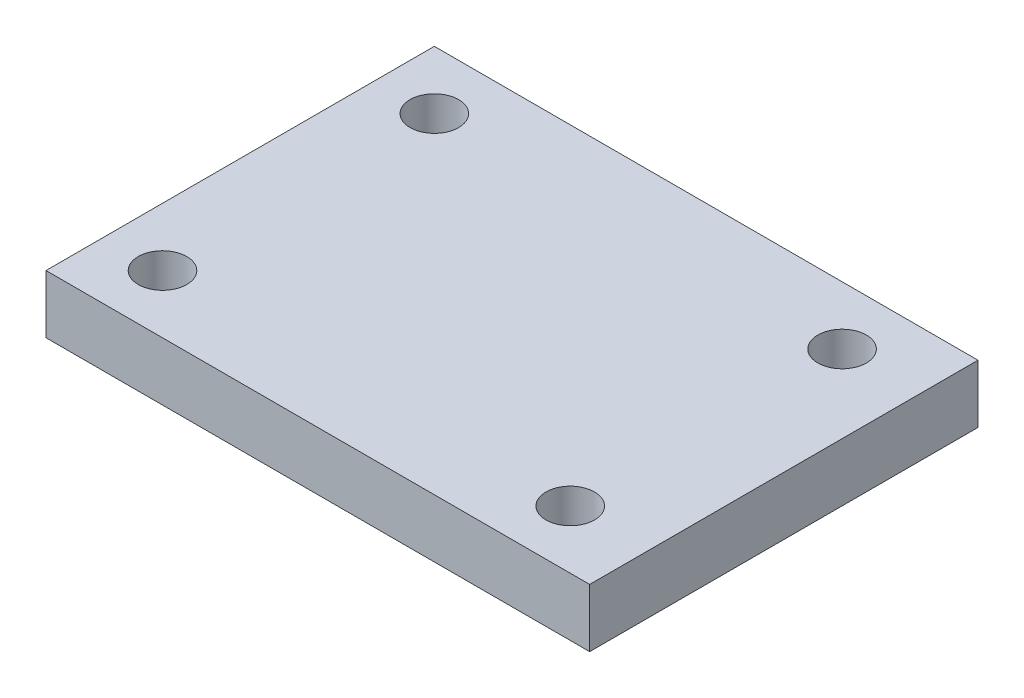
ISO-10303-21;
HEADER;
FILE_DESCRIPTION(('STEP AP214'),'2;1');
FILE_NAME('part.step','',(''),(''),'','','');
FILE_SCHEMA(('AUTOMOTIVE_DESIGN { 1 0 10303 214 1 1 1 1 }'));
ENDSEC;
DATA;
#1=APPLICATION_CONTEXT('core data for automotive mechanical design processes');
#2=APPLICATION_PROTOCOL_DEFINITION('international standard','automotive_design',2000,#1);
#3=PRODUCT_CONTEXT('',#1,'mechanical');
#4=PRODUCT('Part','Part','',(#3));
#5=PRODUCT_RELATED_PRODUCT_CATEGORY('part','',(#4));
#6=PRODUCT_DEFINITION_FORMATION('','',#4);
#7=PRODUCT_DEFINITION_CONTEXT('part definition',#1,'design');
#8=PRODUCT_DEFINITION('design','',#6,#7);
#9=PRODUCT_DEFINITION_SHAPE('','',#8);
#10=(LENGTH_UNIT() NAMED_UNIT(*) SI_UNIT(.MILLI.,.METRE.));
#11=(NAMED_UNIT(*) PLANE_ANGLE_UNIT() SI_UNIT($,.RADIAN.));
#12=(NAMED_UNIT(*) SI_UNIT($,.STERADIAN.) SOLID_ANGLE_UNIT());
#13=UNCERTAINTY_MEASURE_WITH_UNIT(LENGTH_MEASURE(1.E-05),#10,'distance_accuracy_value','');
#14=(GEOMETRIC_REPRESENTATION_CONTEXT(3) GLOBAL_UNCERTAINTY_ASSIGNED_CONTEXT((#13)) GLOBAL_UNIT_ASSIGNED_CONTEXT((#10,
#11,#12)) REPRESENTATION_CONTEXT('',''));
#15=CARTESIAN_POINT('',(0.,0.,0.));
#16=DIRECTION('',(0.,0.,1.));
#17=DIRECTION('',(1.,0.,0.));
#18=AXIS2_PLACEMENT_3D('',#15,#16,#17);
#19=CARTESIAN_POINT('',(14.,3.,10.));
#20=DIRECTION('',(-1.,0.,0.));
#21=DIRECTION('',(0.,0.,1.));
#22=AXIS2_PLACEMENT_3D('',#19,#20,#21);
#23=PLANE('',#22);
#24=DIRECTION('',(0.,0.,-1.));
#25=VECTOR('',#24,1.);
#26=CARTESIAN_POINT('',(14.,0.,10.));
#27=LINE('',#26,#25);
#28=CARTESIAN_POINT('',(14.,0.,10.));
#29=VERTEX_POINT('',#28);
#30=CARTESIAN_POINT('',(14.,0.,-10.));
#31=VERTEX_POINT('',#30);
#32=EDGE_CURVE('E101',#29,#31,#27,.T.);
#33=ORIENTED_EDGE('',*,*,#32,.T.);
#34=DIRECTION('',(0.,-1.,0.));
#35=VECTOR('',#34,1.);
#36=CARTESIAN_POINT('',(14.,3.,-10.));
#37=LINE('',#36,#35);
#38=CARTESIAN_POINT('',(14.,3.,-10.));
#39=VERTEX_POINT('',#38);
#40=EDGE_CURVE('E11',#39,#31,#37,.T.);
#41=ORIENTED_EDGE('',*,*,#40,.F.);
#42=DIRECTION('',(0.,0.,-1.));
#43=VECTOR('',#42,1.);
#44=CARTESIAN_POINT('',(14.,3.,10.));
#45=LINE('',#44,#43);
#46=CARTESIAN_POINT('',(14.,3.,10.));
#47=VERTEX_POINT('',#46);
#48=EDGE_CURVE('E89',#47,#39,#45,.T.);
#49=ORIENTED_EDGE('',*,*,#48,.F.);
#50=DIRECTION('',(0.,-1.,0.));
#51=VECTOR('',#50,1.);
#52=CARTESIAN_POINT('',(14.,3.,10.));
#53=LINE('',#52,#51);
#54=EDGE_CURVE('E97',#47,#29,#53,.T.);
#55=ORIENTED_EDGE('',*,*,#54,.T.);
#56=EDGE_LOOP('',(#33,#41,#49,#55));
#57=FACE_BOUND('',#56,.T.);
#58=ADVANCED_FACE('F38',(#57),#23,.F.);
#59=CARTESIAN_POINT('',(-14.,3.,-10.));
#60=DIRECTION('',(0.,0.,1.));
#61=DIRECTION('',(1.,0.,0.));
#62=AXIS2_PLACEMENT_3D('',#59,#60,#61);
#63=PLANE('',#62);
#64=DIRECTION('',(-1.,0.,0.));
#65=VECTOR('',#64,1.);
#66=CARTESIAN_POINT('',(-14.,0.,-10.));
#67=LINE('',#66,#65);
#68=CARTESIAN_POINT('',(-14.,0.,-10.));
#69=VERTEX_POINT('',#68);
#70=EDGE_CURVE('E93',#31,#69,#67,.T.);
#71=ORIENTED_EDGE('',*,*,#70,.T.);
#72=DIRECTION('',(0.,-1.,0.));
#73=VECTOR('',#72,1.);
#74=CARTESIAN_POINT('',(-14.,3.,-10.));
#75=LINE('',#74,#73);
#76=CARTESIAN_POINT('',(-14.,3.,-10.));
#77=VERTEX_POINT('',#76);
#78=EDGE_CURVE('E46',#77,#69,#75,.T.);
#79=ORIENTED_EDGE('',*,*,#78,.F.);
#80=DIRECTION('',(-1.,0.,0.));
#81=VECTOR('',#80,1.);
#82=CARTESIAN_POINT('',(-14.,3.,-10.));
#83=LINE('',#82,#81);
#84=EDGE_CURVE('E84',#39,#77,#83,.T.);
#85=ORIENTED_EDGE('',*,*,#84,.F.);
#86=ORIENTED_EDGE('',*,*,#40,.T.);
#87=EDGE_LOOP('',(#71,#79,#85,#86));
#88=FACE_BOUND('',#87,.T.);
#89=ADVANCED_FACE('F92',(#88),#63,.F.);
#90=CARTESIAN_POINT('',(-14.,3.,10.));
#91=DIRECTION('',(1.,0.,0.));
#92=DIRECTION('',(0.,0.,-1.));
#93=AXIS2_PLACEMENT_3D('',#90,#91,#92);
#94=PLANE('',#93);
#95=DIRECTION('',(0.,0.,1.));
#96=VECTOR('',#95,1.);
#97=CARTESIAN_POINT('',(-14.,0.,10.));
#98=LINE('',#97,#96);
#99=CARTESIAN_POINT('',(-14.,0.,10.));
#100=VERTEX_POINT('',#99);
#101=EDGE_CURVE('E71',#69,#100,#98,.T.);
#102=ORIENTED_EDGE('',*,*,#101,.T.);
#103=DIRECTION('',(0.,-1.,0.));
#104=VECTOR('',#103,1.);
#105=CARTESIAN_POINT('',(-14.,3.,10.));
#106=LINE('',#105,#104);
#107=CARTESIAN_POINT('',(-14.,3.,10.));
#108=VERTEX_POINT('',#107);
#109=EDGE_CURVE('E94',#108,#100,#106,.T.);
#110=ORIENTED_EDGE('',*,*,#109,.F.);
#111=DIRECTION('',(0.,0.,1.));
#112=VECTOR('',#111,1.);
#113=CARTESIAN_POINT('',(-14.,3.,10.));
#114=LINE('',#113,#112);
#115=EDGE_CURVE('E87',#77,#108,#114,.T.);
#116=ORIENTED_EDGE('',*,*,#115,.F.);
#117=ORIENTED_EDGE('',*,*,#78,.T.);
#118=EDGE_LOOP('',(#102,#110,#116,#117));
#119=FACE_BOUND('',#118,.T.);
#120=ADVANCED_FACE('F95',(#119),#94,.F.);
#121=CARTESIAN_POINT('',(-14.,3.,10.));
#122=DIRECTION('',(0.,0.,-1.));
#123=DIRECTION('',(-1.,0.,0.));
#124=AXIS2_PLACEMENT_3D('',#121,#122,#123);
#125=PLANE('',#124);
#126=DIRECTION('',(1.,0.,0.));
#127=VECTOR('',#126,1.);
#128=CARTESIAN_POINT('',(-14.,0.,10.));
#129=LINE('',#128,#127);
#130=EDGE_CURVE('E77',#100,#29,#129,.T.);
#131=ORIENTED_EDGE('',*,*,#130,.T.);
#132=ORIENTED_EDGE('',*,*,#54,.F.);
#133=DIRECTION('',(1.,0.,0.));
#134=VECTOR('',#133,1.);
#135=CARTESIAN_POINT('',(-14.,3.,10.));
#136=LINE('',#135,#134);
#137=EDGE_CURVE('E54',#108,#47,#136,.T.);
#138=ORIENTED_EDGE('',*,*,#137,.F.);
#139=ORIENTED_EDGE('',*,*,#109,.T.);
#140=EDGE_LOOP('',(#131,#132,#138,#139));
#141=FACE_BOUND('',#140,.T.);
#142=ADVANCED_FACE('F109',(#141),#125,.F.);
#143=CARTESIAN_POINT('',(0.,3.,0.));
#144=DIRECTION('',(0.,-1.,0.));
#145=DIRECTION('',(0.,0.,-1.));
#146=AXIS2_PLACEMENT_3D('',#143,#144,#145);
#147=PLANE('',#146);
#148=CARTESIAN_POINT('',(-11.,3.,-7.));
#149=DIRECTION('',(0.,1.,0.));
#150=DIRECTION('',(0.,0.,1.));
#151=AXIS2_PLACEMENT_3D('',#148,#149,#150);
#152=CIRCLE('',#151,1.25);
#153=CARTESIAN_POINT('',(-11.,3.,-5.75));
#154=VERTEX_POINT('',#153);
#155=EDGE_CURVE('E135',#154,#154,#152,.T.);
#156=ORIENTED_EDGE('',*,*,#155,.F.);
#157=EDGE_LOOP('',(#156));
#158=FACE_BOUND('',#157,.T.);
#159=CARTESIAN_POINT('',(10.,3.,-7.));
#160=DIRECTION('',(0.,1.,0.));
#161=DIRECTION('',(0.,0.,1.));
#162=AXIS2_PLACEMENT_3D('',#159,#160,#161);
#163=CIRCLE('',#162,1.25);
#164=CARTESIAN_POINT('',(10.,3.,-5.75));
#165=VERTEX_POINT('',#164);
#166=EDGE_CURVE('E129',#165,#165,#163,.T.);
#167=ORIENTED_EDGE('',*,*,#166,.F.);
#168=EDGE_LOOP('',(#167));
#169=FACE_BOUND('',#168,.T.);
#170=CARTESIAN_POINT('',(10.,3.,7.));
#171=DIRECTION('',(0.,1.,0.));
#172=DIRECTION('',(0.,0.,1.));
#173=AXIS2_PLACEMENT_3D('',#170,#171,#172);
#174=CIRCLE('',#173,1.25);
#175=CARTESIAN_POINT('',(10.,3.,8.25));
#176=VERTEX_POINT('',#175);
#177=EDGE_CURVE('E123',#176,#176,#174,.T.);
#178=ORIENTED_EDGE('',*,*,#177,.F.);
#179=EDGE_LOOP('',(#178));
#180=FACE_BOUND('',#179,.T.);
#181=CARTESIAN_POINT('',(-11.,3.,7.));
#182=DIRECTION('',(0.,1.,0.));
#183=DIRECTION('',(0.,0.,1.));
#184=AXIS2_PLACEMENT_3D('',#181,#182,#183);
#185=CIRCLE('',#184,1.25);
#186=CARTESIAN_POINT('',(-11.,3.,8.25));
#187=VERTEX_POINT('',#186);
#188=EDGE_CURVE('E117',#187,#187,#185,.T.);
#189=ORIENTED_EDGE('',*,*,#188,.F.);
#190=EDGE_LOOP('',(#189));
#191=FACE_BOUND('',#190,.T.);
#192=ORIENTED_EDGE('',*,*,#48,.T.);
#193=ORIENTED_EDGE('',*,*,#84,.T.);
#194=ORIENTED_EDGE('',*,*,#115,.T.);
#195=ORIENTED_EDGE('',*,*,#137,.T.);
#196=EDGE_LOOP('',(#192,#193,#194,#195));
#197=FACE_BOUND('',#196,.T.);
#198=ADVANCED_FACE('F85',(#158,#169,#180,#191,#197),#147,.F.);
#199=CARTESIAN_POINT('',(0.,0.,0.));
#200=DIRECTION('',(0.,-1.,0.));
#201=DIRECTION('',(0.,0.,-1.));
#202=AXIS2_PLACEMENT_3D('',#199,#200,#201);
#203=PLANE('',#202);
#204=CARTESIAN_POINT('',(-11.,0.,-7.));
#205=DIRECTION('',(0.,1.,0.));
#206=DIRECTION('',(0.,0.,1.));
#207=AXIS2_PLACEMENT_3D('',#204,#205,#206);
#208=CIRCLE('',#207,1.25);
#209=CARTESIAN_POINT('',(-11.,0.,-5.75));
#210=VERTEX_POINT('',#209);
#211=EDGE_CURVE('E132',#210,#210,#208,.T.);
#212=ORIENTED_EDGE('',*,*,#211,.T.);
#213=EDGE_LOOP('',(#212));
#214=FACE_BOUND('',#213,.T.);
#215=CARTESIAN_POINT('',(10.,0.,-7.));
#216=DIRECTION('',(0.,1.,0.));
#217=DIRECTION('',(0.,0.,1.));
#218=AXIS2_PLACEMENT_3D('',#215,#216,#217);
#219=CIRCLE('',#218,1.25);
#220=CARTESIAN_POINT('',(10.,0.,-5.75));
#221=VERTEX_POINT('',#220);
#222=EDGE_CURVE('E126',#221,#221,#219,.T.);
#223=ORIENTED_EDGE('',*,*,#222,.T.);
#224=EDGE_LOOP('',(#223));
#225=FACE_BOUND('',#224,.T.);
#226=CARTESIAN_POINT('',(10.,0.,7.));
#227=DIRECTION('',(0.,1.,0.));
#228=DIRECTION('',(0.,0.,1.));
#229=AXIS2_PLACEMENT_3D('',#226,#227,#228);
#230=CIRCLE('',#229,1.25);
#231=CARTESIAN_POINT('',(10.,0.,8.25));
#232=VERTEX_POINT('',#231);
#233=EDGE_CURVE('E120',#232,#232,#230,.T.);
#234=ORIENTED_EDGE('',*,*,#233,.T.);
#235=EDGE_LOOP('',(#234));
#236=FACE_BOUND('',#235,.T.);
#237=CARTESIAN_POINT('',(-11.,0.,7.));
#238=DIRECTION('',(0.,1.,0.));
#239=DIRECTION('',(0.,0.,1.));
#240=AXIS2_PLACEMENT_3D('',#237,#238,#239);
#241=CIRCLE('',#240,1.25);
#242=CARTESIAN_POINT('',(-11.,0.,8.25));
#243=VERTEX_POINT('',#242);
#244=EDGE_CURVE('E104',#243,#243,#241,.T.);
#245=ORIENTED_EDGE('',*,*,#244,.T.);
#246=EDGE_LOOP('',(#245));
#247=FACE_BOUND('',#246,.T.);
#248=ORIENTED_EDGE('',*,*,#32,.F.);
#249=ORIENTED_EDGE('',*,*,#130,.F.);
#250=ORIENTED_EDGE('',*,*,#101,.F.);
#251=ORIENTED_EDGE('',*,*,#70,.F.);
#252=EDGE_LOOP('',(#248,#249,#250,#251));
#253=FACE_BOUND('',#252,.T.);
#254=ADVANCED_FACE('F112',(#214,#225,#236,#247,#253),#203,.T.);
#255=CARTESIAN_POINT('',(-11.,3.,7.));
#256=DIRECTION('',(0.,1.,0.));
#257=DIRECTION('',(0.,0.,1.));
#258=AXIS2_PLACEMENT_3D('',#255,#256,#257);
#259=CYLINDRICAL_SURFACE('',#258,1.25);
#260=ORIENTED_EDGE('',*,*,#244,.F.);
#261=EDGE_LOOP('',(#260));
#262=FACE_BOUND('',#261,.T.);
#263=ORIENTED_EDGE('',*,*,#188,.T.);
#264=EDGE_LOOP('',(#263));
#265=FACE_BOUND('',#264,.T.);
#266=ADVANCED_FACE('F150',(#262,#265),#259,.F.);
#267=CARTESIAN_POINT('',(10.,3.,7.));
#268=DIRECTION('',(0.,1.,0.));
#269=DIRECTION('',(0.,0.,1.));
#270=AXIS2_PLACEMENT_3D('',#267,#268,#269);
#271=CYLINDRICAL_SURFACE('',#270,1.25);
#272=ORIENTED_EDGE('',*,*,#233,.F.);
#273=EDGE_LOOP('',(#272));
#274=FACE_BOUND('',#273,.T.);
#275=ORIENTED_EDGE('',*,*,#177,.T.);
#276=EDGE_LOOP('',(#275));
#277=FACE_BOUND('',#276,.T.);
#278=ADVANCED_FACE('F152',(#274,#277),#271,.F.);
#279=CARTESIAN_POINT('',(10.,3.,-7.));
#280=DIRECTION('',(0.,1.,0.));
#281=DIRECTION('',(0.,0.,1.));
#282=AXIS2_PLACEMENT_3D('',#279,#280,#281);
#283=CYLINDRICAL_SURFACE('',#282,1.25);
#284=ORIENTED_EDGE('',*,*,#222,.F.);
#285=EDGE_LOOP('',(#284));
#286=FACE_BOUND('',#285,.T.);
#287=ORIENTED_EDGE('',*,*,#166,.T.);
#288=EDGE_LOOP('',(#287));
#289=FACE_BOUND('',#288,.T.);
#290=ADVANCED_FACE('F159',(#286,#289),#283,.F.);
#291=CARTESIAN_POINT('',(-11.,3.,-7.));
#292=DIRECTION('',(0.,1.,0.));
#293=DIRECTION('',(0.,0.,1.));
#294=AXIS2_PLACEMENT_3D('',#291,#292,#293);
#295=CYLINDRICAL_SURFACE('',#294,1.25);
#296=ORIENTED_EDGE('',*,*,#211,.F.);
#297=EDGE_LOOP('',(#296));
#298=FACE_BOUND('',#297,.T.);
#299=ORIENTED_EDGE('',*,*,#155,.T.);
#300=EDGE_LOOP('',(#299));
#301=FACE_BOUND('',#300,.T.);
#302=ADVANCED_FACE('F139',(#298,#301),#295,.F.);
#303=CLOSED_SHELL('',(#58,#89,#120,#142,#198,#254,#266,#278,#290,#302));
#304=MANIFOLD_SOLID_BREP('B2',#303);
#305=ADVANCED_BREP_SHAPE_REPRESENTATION('',(#18,#304),#14);
#306=SHAPE_DEFINITION_REPRESENTATION(#9,#305);
ENDSEC;
END-ISO-10303-21;
